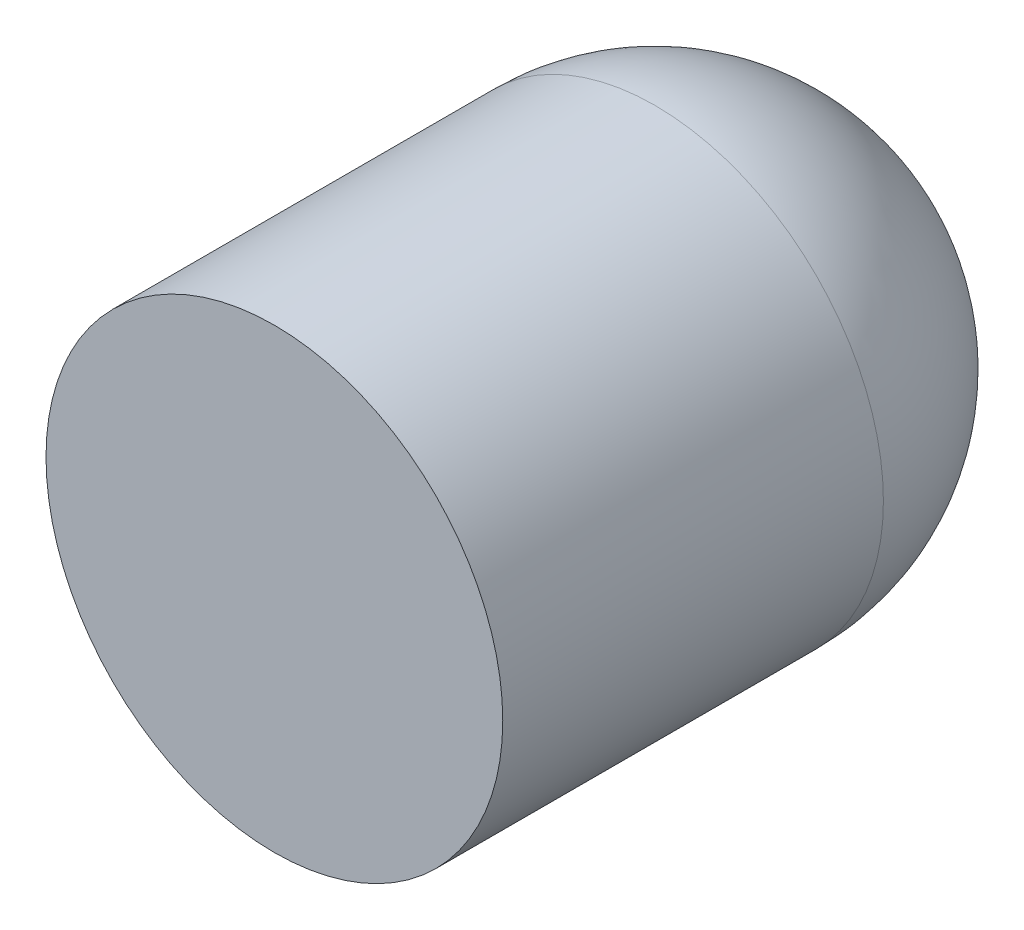
ISO-10303-21;
HEADER;
FILE_DESCRIPTION(('STEP AP214'),'2;1');
FILE_NAME('part.step','',(''),(''),'','','');
FILE_SCHEMA(('AUTOMOTIVE_DESIGN { 1 0 10303 214 1 1 1 1 }'));
ENDSEC;
DATA;
#1=APPLICATION_CONTEXT('core data for automotive mechanical design processes');
#2=APPLICATION_PROTOCOL_DEFINITION('international standard','automotive_design',2000,#1);
#3=PRODUCT_CONTEXT('',#1,'mechanical');
#4=PRODUCT('Part','Part','',(#3));
#5=PRODUCT_RELATED_PRODUCT_CATEGORY('part','',(#4));
#6=PRODUCT_DEFINITION_FORMATION('','',#4);
#7=PRODUCT_DEFINITION_CONTEXT('part definition',#1,'design');
#8=PRODUCT_DEFINITION('design','',#6,#7);
#9=PRODUCT_DEFINITION_SHAPE('','',#8);
#10=(LENGTH_UNIT() NAMED_UNIT(*) SI_UNIT(.MILLI.,.METRE.));
#11=(NAMED_UNIT(*) PLANE_ANGLE_UNIT() SI_UNIT($,.RADIAN.));
#12=(NAMED_UNIT(*) SI_UNIT($,.STERADIAN.) SOLID_ANGLE_UNIT());
#13=UNCERTAINTY_MEASURE_WITH_UNIT(LENGTH_MEASURE(1.E-05),#10,'distance_accuracy_value','');
#14=(GEOMETRIC_REPRESENTATION_CONTEXT(3) GLOBAL_UNCERTAINTY_ASSIGNED_CONTEXT((#13)) GLOBAL_UNIT_ASSIGNED_CONTEXT((#10,
#11,#12)) REPRESENTATION_CONTEXT('',''));
#15=CARTESIAN_POINT('',(0.,0.,0.));
#16=DIRECTION('',(0.,0.,1.));
#17=DIRECTION('',(1.,0.,0.));
#18=AXIS2_PLACEMENT_3D('',#15,#16,#17);
#19=CARTESIAN_POINT('',(0.,0.,127.));
#20=DIRECTION('',(0.,0.,-1.));
#21=DIRECTION('',(-1.,0.,0.));
#22=AXIS2_PLACEMENT_3D('',#19,#20,#21);
#23=CYLINDRICAL_SURFACE('',#22,76.2);
#24=CARTESIAN_POINT('',(0.,0.,127.));
#25=DIRECTION('',(0.,0.,1.));
#26=DIRECTION('',(1.,0.,0.));
#27=AXIS2_PLACEMENT_3D('',#24,#25,#26);
#28=CIRCLE('',#27,76.2);
#29=CARTESIAN_POINT('',(76.2,0.,127.));
#30=VERTEX_POINT('',#29);
#31=EDGE_CURVE('E11',#30,#30,#28,.T.);
#32=ORIENTED_EDGE('',*,*,#31,.F.);
#33=EDGE_LOOP('',(#32));
#34=FACE_BOUND('',#33,.T.);
#35=CARTESIAN_POINT('',(0.,0.,0.));
#36=DIRECTION('',(0.,0.,1.));
#37=DIRECTION('',(1.,0.,0.));
#38=AXIS2_PLACEMENT_3D('',#35,#36,#37);
#39=CIRCLE('',#38,76.2);
#40=CARTESIAN_POINT('',(76.2,0.,0.));
#41=VERTEX_POINT('',#40);
#42=EDGE_CURVE('E54',#41,#41,#39,.T.);
#43=ORIENTED_EDGE('',*,*,#42,.T.);
#44=EDGE_LOOP('',(#43));
#45=FACE_BOUND('',#44,.T.);
#46=ADVANCED_FACE('F43',(#34,#45),#23,.T.);
#47=CARTESIAN_POINT('',(0.,0.,127.));
#48=DIRECTION('',(0.,0.,1.));
#49=DIRECTION('',(1.,0.,0.));
#50=AXIS2_PLACEMENT_3D('',#47,#48,#49);
#51=PLANE('',#50);
#52=ORIENTED_EDGE('',*,*,#31,.T.);
#53=EDGE_LOOP('',(#52));
#54=FACE_BOUND('',#53,.T.);
#55=ADVANCED_FACE('F59',(#54),#51,.T.);
#56=CARTESIAN_POINT('',(0.,0.,-76.2000000000052));
#57=CARTESIAN_POINT('',(0.,2.69767866619666,-76.2000000826798));
#58=CARTESIAN_POINT('',(0.,6.89169126953619,-76.002027800845));
#59=CARTESIAN_POINT('',(0.,12.2826602264434,-75.3485352474368));
#60=CARTESIAN_POINT('',(0.,18.7790281895478,-73.9270491279757));
#61=CARTESIAN_POINT('',(0.,23.7465158441685,-72.4745433451933));
#62=CARTESIAN_POINT('',(0.,28.3554178233081,-70.7984948071295));
#63=CARTESIAN_POINT('',(0.,32.8471084380935,-68.8296744849353));
#64=CARTESIAN_POINT('',(0.,37.2029918762154,-66.5762284892021));
#65=CARTESIAN_POINT('',(0.,41.4050480953298,-64.0474732930193));
#66=CARTESIAN_POINT('',(0.,45.4358995112548,-61.2538643497458));
#67=CARTESIAN_POINT('',(0.,49.2788708105485,-58.2069557422821));
#68=CARTESIAN_POINT('',(0.,52.9180546681088,-54.919362146449));
#69=CARTESIAN_POINT('',(0.,56.3384219157531,-51.4046597560853));
#70=CARTESIAN_POINT('',(0.,59.5258162944255,-47.6773953793846));
#71=CARTESIAN_POINT('',(0.,62.4670649283458,-43.7529729682521));
#72=CARTESIAN_POINT('',(0.,65.4853680216497,-39.1344571864204));
#73=CARTESIAN_POINT('',(0.,68.4461555392459,-33.7636776833661));
#74=CARTESIAN_POINT('',(0.,71.1862341142374,-27.5957087069481));
#75=CARTESIAN_POINT('',(0.,73.3194418883077,-21.1924927349172));
#76=CARTESIAN_POINT('',(0.,74.5373623870638,-16.1238488746767));
#77=CARTESIAN_POINT('',(0.,75.1842760627894,-12.5044296825597));
#78=CARTESIAN_POINT('',(0.,75.4934910963171,-10.3825924500332));
#79=CARTESIAN_POINT('',(0.,75.6506679548747,-9.16745521836529));
#80=CARTESIAN_POINT('',(0.,75.7882867245922,-7.94988115312511));
#81=CARTESIAN_POINT('',(0.,75.9063118191611,-6.73038348117474));
#82=CARTESIAN_POINT('',(0.,76.0047127045279,-5.5088919210826));
#83=CARTESIAN_POINT('',(0.,76.0834639467382,-4.28708276327274));
#84=CARTESIAN_POINT('',(0.,76.1425451932216,-3.05674298296688));
#85=CARTESIAN_POINT('',(0.,76.1819411725066,-1.86434283114296));
#86=CARTESIAN_POINT('',(0.,76.1967165806909,-0.860935356090169));
#87=CARTESIAN_POINT('',(0.,76.2,-0.287944883578275));
#88=CARTESIAN_POINT('',(0.,76.1999999999999,5.17822020011488E-12));
#89=B_SPLINE_CURVE_WITH_KNOTS('',4,(#56,#57,#58,#59,#60,#61,#62,#63,#64,#65,#66,#67,#68,#69,#70,
#71,#72,#73,#74,#75,#76,#77,#78,#79,#80,#81,#82,#83,#84,#85,#86,#87,#88),.UNSPECIFIED.,.F.,.F.,
(5,1,1,1,1,1,1,1,1,1,1,1,1,1,1,1,1,1,1,1,1,1,1,1,1,1,1,1,1,5),(0.0599458977248712,
0.144693638140354,0.191700830891551,0.230189784284791,0.268680183011475,0.307169946967468,
0.345660246771087,0.384150516837926,0.422641578970971,0.461131776627404,0.499622515005488,
0.538112994354119,0.576603579123988,0.615094141223893,0.653584680847913,0.69207532631908,
0.749811160910634,0.807547041487048,0.865282934052946,0.903773521074816,0.913396167715941,
0.923018814357066,0.932641464388229,0.942264114419392,0.951886764450556,0.961509414481719,
0.971132060861289,0.98075470724086,0.99037735362043,1.),.UNSPECIFIED.);
#90=CARTESIAN_POINT('',(0.,0.,-480.060000000396));
#91=DIRECTION('',(0.,0.,-1.));
#92=AXIS1_PLACEMENT('',#90,#91);
#93=SURFACE_OF_REVOLUTION('',#89,#92);
#94=ORIENTED_EDGE('',*,*,#42,.F.);
#95=EDGE_LOOP('',(#94));
#96=FACE_BOUND('',#95,.T.);
#97=CARTESIAN_POINT('',(0.,0.,-76.2000000000052));
#98=VERTEX_POINT('',#97);
#99=VERTEX_LOOP('',#98);
#100=FACE_BOUND('',#99,.T.);
#101=ADVANCED_FACE('F45',(#96,#100),#93,.F.);
#102=CLOSED_SHELL('',(#46,#55,#101));
#103=MANIFOLD_SOLID_BREP('B2',#102);
#104=ADVANCED_BREP_SHAPE_REPRESENTATION('',(#18,#103),#14);
#105=SHAPE_DEFINITION_REPRESENTATION(#9,#104);
ENDSEC;
END-ISO-10303-21;
